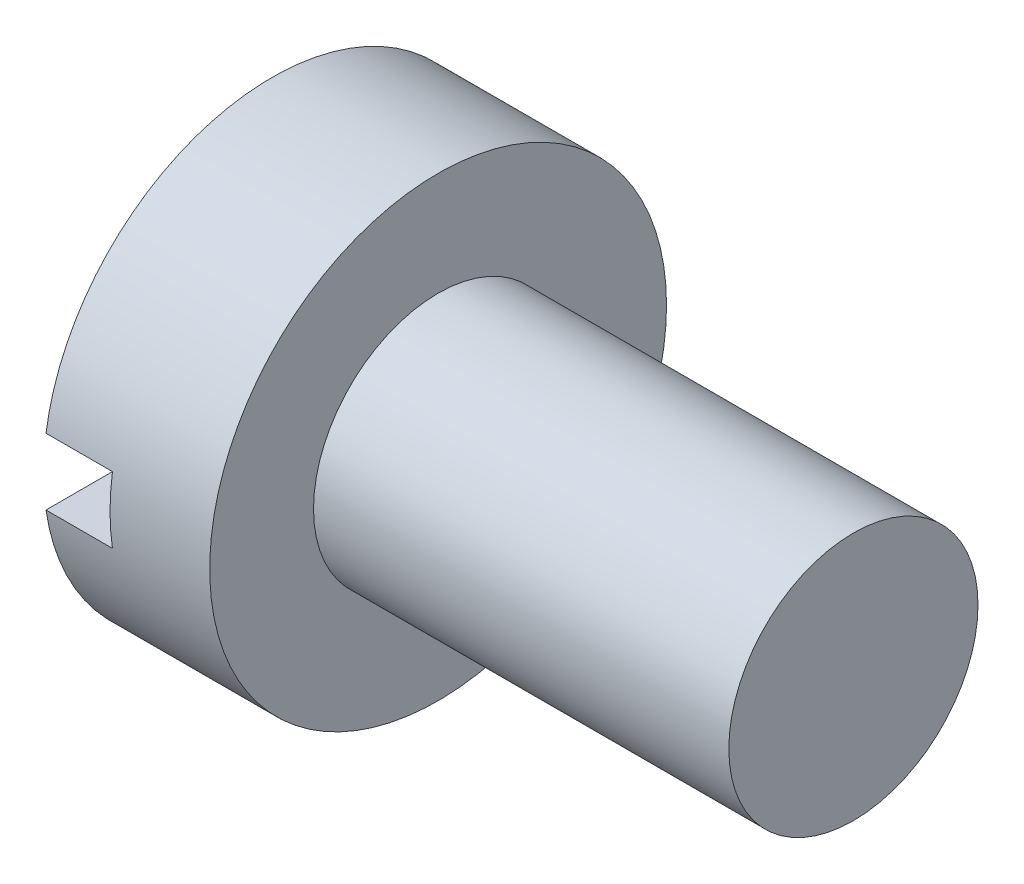
ISO-10303-21;
HEADER;
FILE_DESCRIPTION(('STEP AP214'),'2;1');
FILE_NAME('part.step','',(''),(''),'','','');
FILE_SCHEMA(('AUTOMOTIVE_DESIGN { 1 0 10303 214 1 1 1 1 }'));
ENDSEC;
DATA;
#1=APPLICATION_CONTEXT('core data for automotive mechanical design processes');
#2=APPLICATION_PROTOCOL_DEFINITION('international standard','automotive_design',2000,#1);
#3=PRODUCT_CONTEXT('',#1,'mechanical');
#4=PRODUCT('Part','Part','',(#3));
#5=PRODUCT_RELATED_PRODUCT_CATEGORY('part','',(#4));
#6=PRODUCT_DEFINITION_FORMATION('','',#4);
#7=PRODUCT_DEFINITION_CONTEXT('part definition',#1,'design');
#8=PRODUCT_DEFINITION('design','',#6,#7);
#9=PRODUCT_DEFINITION_SHAPE('','',#8);
#10=(LENGTH_UNIT() NAMED_UNIT(*) SI_UNIT(.MILLI.,.METRE.));
#11=(NAMED_UNIT(*) PLANE_ANGLE_UNIT() SI_UNIT($,.RADIAN.));
#12=(NAMED_UNIT(*) SI_UNIT($,.STERADIAN.) SOLID_ANGLE_UNIT());
#13=UNCERTAINTY_MEASURE_WITH_UNIT(LENGTH_MEASURE(1.E-05),#10,'distance_accuracy_value','');
#14=(GEOMETRIC_REPRESENTATION_CONTEXT(3) GLOBAL_UNCERTAINTY_ASSIGNED_CONTEXT((#13)) GLOBAL_UNIT_ASSIGNED_CONTEXT((#10,
#11,#12)) REPRESENTATION_CONTEXT('',''));
#15=CARTESIAN_POINT('',(0.,0.,0.));
#16=DIRECTION('',(0.,0.,1.));
#17=DIRECTION('',(1.,0.,0.));
#18=AXIS2_PLACEMENT_3D('',#15,#16,#17);
#19=CARTESIAN_POINT('',(0.,0.,0.));
#20=DIRECTION('',(-1.,0.,0.));
#21=DIRECTION('',(0.,0.,1.));
#22=AXIS2_PLACEMENT_3D('',#19,#20,#21);
#23=PLANE('',#22);
#24=DIRECTION('',(0.,0.,-1.));
#25=VECTOR('',#24,1.);
#26=CARTESIAN_POINT('',(0.,0.399999999999997,-2.75));
#27=LINE('',#26,#25);
#28=CARTESIAN_POINT('',(0.,0.399999999999999,2.72075357208256));
#29=VERTEX_POINT('',#28);
#30=CARTESIAN_POINT('',(0.,0.399999999999997,-2.72075357208256));
#31=VERTEX_POINT('',#30);
#32=EDGE_CURVE('E82',#29,#31,#27,.T.);
#33=ORIENTED_EDGE('',*,*,#32,.F.);
#34=CARTESIAN_POINT('',(0.,0.,0.));
#35=DIRECTION('',(1.,0.,0.));
#36=DIRECTION('',(0.,0.,-1.));
#37=AXIS2_PLACEMENT_3D('',#34,#35,#36);
#38=CIRCLE('',#37,2.75);
#39=EDGE_CURVE('E88',#31,#29,#38,.T.);
#40=ORIENTED_EDGE('',*,*,#39,.F.);
#41=EDGE_LOOP('',(#33,#40));
#42=FACE_BOUND('',#41,.T.);
#43=ADVANCED_FACE('F32',(#42),#23,.T.);
#44=DIRECTION('',(0.,0.,1.));
#45=VECTOR('',#44,1.);
#46=CARTESIAN_POINT('',(0.,-0.400000000000001,-2.75));
#47=LINE('',#46,#45);
#48=CARTESIAN_POINT('',(0.,-0.400000000000001,-2.72075357208256));
#49=VERTEX_POINT('',#48);
#50=CARTESIAN_POINT('',(0.,-0.399999999999999,2.72075357208256));
#51=VERTEX_POINT('',#50);
#52=EDGE_CURVE('E76',#49,#51,#47,.T.);
#53=ORIENTED_EDGE('',*,*,#52,.F.);
#54=EDGE_CURVE('E81',#51,#49,#38,.T.);
#55=ORIENTED_EDGE('',*,*,#54,.F.);
#56=EDGE_LOOP('',(#53,#55));
#57=FACE_BOUND('',#56,.T.);
#58=ADVANCED_FACE('F34',(#57),#23,.T.);
#59=CARTESIAN_POINT('',(7.,0.,0.));
#60=DIRECTION('',(1.,0.,0.));
#61=DIRECTION('',(0.,0.,-1.));
#62=AXIS2_PLACEMENT_3D('',#59,#60,#61);
#63=CYLINDRICAL_SURFACE('',#62,2.75);
#64=DIRECTION('',(1.,0.,0.));
#65=VECTOR('',#64,1.);
#66=CARTESIAN_POINT('',(7.,0.399999999999997,-2.72075357208256));
#67=LINE('',#66,#65);
#68=CARTESIAN_POINT('',(0.8,0.399999999999997,-2.72075357208256));
#69=VERTEX_POINT('',#68);
#70=EDGE_CURVE('E11',#31,#69,#67,.T.);
#71=ORIENTED_EDGE('',*,*,#70,.F.);
#72=ORIENTED_EDGE('',*,*,#39,.T.);
#73=DIRECTION('',(1.,0.,0.));
#74=VECTOR('',#73,1.);
#75=CARTESIAN_POINT('',(7.,0.399999999999999,2.72075357208256));
#76=LINE('',#75,#74);
#77=CARTESIAN_POINT('',(0.8,0.399999999999999,2.72075357208256));
#78=VERTEX_POINT('',#77);
#79=EDGE_CURVE('E99',#78,#29,#76,.F.);
#80=ORIENTED_EDGE('',*,*,#79,.F.);
#81=CARTESIAN_POINT('',(0.8,0.,0.));
#82=DIRECTION('',(-1.,0.,0.));
#83=DIRECTION('',(0.,0.,1.));
#84=AXIS2_PLACEMENT_3D('',#81,#82,#83);
#85=CIRCLE('',#84,2.75);
#86=CARTESIAN_POINT('',(0.8,-0.399999999999999,2.72075357208256));
#87=VERTEX_POINT('',#86);
#88=EDGE_CURVE('E47',#78,#87,#85,.F.);
#89=ORIENTED_EDGE('',*,*,#88,.T.);
#90=DIRECTION('',(1.,0.,0.));
#91=VECTOR('',#90,1.);
#92=CARTESIAN_POINT('',(7.,-0.399999999999999,2.72075357208256));
#93=LINE('',#92,#91);
#94=EDGE_CURVE('E87',#51,#87,#93,.T.);
#95=ORIENTED_EDGE('',*,*,#94,.F.);
#96=ORIENTED_EDGE('',*,*,#54,.T.);
#97=DIRECTION('',(1.,0.,0.));
#98=VECTOR('',#97,1.);
#99=CARTESIAN_POINT('',(7.,-0.400000000000001,-2.72075357208256));
#100=LINE('',#99,#98);
#101=CARTESIAN_POINT('',(0.8,-0.400000000000001,-2.72075357208256));
#102=VERTEX_POINT('',#101);
#103=EDGE_CURVE('E40',#102,#49,#100,.F.);
#104=ORIENTED_EDGE('',*,*,#103,.F.);
#105=EDGE_CURVE('E55',#102,#69,#85,.F.);
#106=ORIENTED_EDGE('',*,*,#105,.T.);
#107=EDGE_LOOP('',(#71,#72,#80,#89,#95,#96,#104,#106));
#108=FACE_BOUND('',#107,.T.);
#109=CARTESIAN_POINT('',(2.,0.,0.));
#110=DIRECTION('',(1.,0.,0.));
#111=DIRECTION('',(0.,0.,-1.));
#112=AXIS2_PLACEMENT_3D('',#109,#110,#111);
#113=CIRCLE('',#112,2.75);
#114=CARTESIAN_POINT('',(2.,0.,-2.75));
#115=VERTEX_POINT('',#114);
#116=EDGE_CURVE('E89',#115,#115,#113,.T.);
#117=ORIENTED_EDGE('',*,*,#116,.F.);
#118=EDGE_LOOP('',(#117));
#119=FACE_BOUND('',#118,.T.);
#120=ADVANCED_FACE('F85',(#108,#119),#63,.T.);
#121=CARTESIAN_POINT('',(2.,2.75,0.));
#122=DIRECTION('',(1.,0.,0.));
#123=DIRECTION('',(0.,0.,-1.));
#124=AXIS2_PLACEMENT_3D('',#121,#122,#123);
#125=PLANE('',#124);
#126=ORIENTED_EDGE('',*,*,#116,.T.);
#127=EDGE_LOOP('',(#126));
#128=FACE_BOUND('',#127,.T.);
#129=CARTESIAN_POINT('',(2.,0.,0.));
#130=DIRECTION('',(1.,0.,0.));
#131=DIRECTION('',(0.,0.,-1.));
#132=AXIS2_PLACEMENT_3D('',#129,#130,#131);
#133=CIRCLE('',#132,1.5);
#134=CARTESIAN_POINT('',(2.,0.,-1.5));
#135=VERTEX_POINT('',#134);
#136=EDGE_CURVE('E93',#135,#135,#133,.T.);
#137=ORIENTED_EDGE('',*,*,#136,.F.);
#138=EDGE_LOOP('',(#137));
#139=FACE_BOUND('',#138,.T.);
#140=ADVANCED_FACE('F118',(#128,#139),#125,.T.);
#141=CARTESIAN_POINT('',(7.,0.,0.));
#142=DIRECTION('',(1.,0.,0.));
#143=DIRECTION('',(0.,0.,-1.));
#144=AXIS2_PLACEMENT_3D('',#141,#142,#143);
#145=CYLINDRICAL_SURFACE('',#144,1.5);
#146=ORIENTED_EDGE('',*,*,#136,.T.);
#147=EDGE_LOOP('',(#146));
#148=FACE_BOUND('',#147,.T.);
#149=CARTESIAN_POINT('',(7.,0.,0.));
#150=DIRECTION('',(1.,0.,0.));
#151=DIRECTION('',(0.,0.,-1.));
#152=AXIS2_PLACEMENT_3D('',#149,#150,#151);
#153=CIRCLE('',#152,1.5);
#154=CARTESIAN_POINT('',(7.,0.,-1.5));
#155=VERTEX_POINT('',#154);
#156=EDGE_CURVE('E110',#155,#155,#153,.T.);
#157=ORIENTED_EDGE('',*,*,#156,.F.);
#158=EDGE_LOOP('',(#157));
#159=FACE_BOUND('',#158,.T.);
#160=ADVANCED_FACE('F115',(#148,#159),#145,.T.);
#161=CARTESIAN_POINT('',(7.,1.5,0.));
#162=DIRECTION('',(1.,0.,0.));
#163=DIRECTION('',(0.,0.,-1.));
#164=AXIS2_PLACEMENT_3D('',#161,#162,#163);
#165=PLANE('',#164);
#166=ORIENTED_EDGE('',*,*,#156,.T.);
#167=EDGE_LOOP('',(#166));
#168=FACE_BOUND('',#167,.T.);
#169=ADVANCED_FACE('F126',(#168),#165,.T.);
#170=CARTESIAN_POINT('',(0.8,0.399999999999997,-2.75));
#171=DIRECTION('',(0.,1.,0.));
#172=DIRECTION('',(0.,0.,1.));
#173=AXIS2_PLACEMENT_3D('',#170,#171,#172);
#174=PLANE('',#173);
#175=ORIENTED_EDGE('',*,*,#79,.T.);
#176=ORIENTED_EDGE('',*,*,#32,.T.);
#177=ORIENTED_EDGE('',*,*,#70,.T.);
#178=DIRECTION('',(0.,0.,-1.));
#179=VECTOR('',#178,1.);
#180=CARTESIAN_POINT('',(0.8,0.399999999999997,-2.75));
#181=LINE('',#180,#179);
#182=EDGE_CURVE('E106',#78,#69,#181,.T.);
#183=ORIENTED_EDGE('',*,*,#182,.F.);
#184=EDGE_LOOP('',(#175,#176,#177,#183));
#185=FACE_BOUND('',#184,.T.);
#186=ADVANCED_FACE('F144',(#185),#174,.F.);
#187=CARTESIAN_POINT('',(0.8,-0.400000000000001,-2.75));
#188=DIRECTION('',(0.,-1.,0.));
#189=DIRECTION('',(0.,0.,-1.));
#190=AXIS2_PLACEMENT_3D('',#187,#188,#189);
#191=PLANE('',#190);
#192=ORIENTED_EDGE('',*,*,#103,.T.);
#193=ORIENTED_EDGE('',*,*,#52,.T.);
#194=ORIENTED_EDGE('',*,*,#94,.T.);
#195=DIRECTION('',(0.,0.,1.));
#196=VECTOR('',#195,1.);
#197=CARTESIAN_POINT('',(0.8,-0.400000000000001,-2.75));
#198=LINE('',#197,#196);
#199=EDGE_CURVE('E77',#102,#87,#198,.T.);
#200=ORIENTED_EDGE('',*,*,#199,.F.);
#201=EDGE_LOOP('',(#192,#193,#194,#200));
#202=FACE_BOUND('',#201,.T.);
#203=ADVANCED_FACE('F75',(#202),#191,.F.);
#204=CARTESIAN_POINT('',(0.8,0.,0.));
#205=DIRECTION('',(-1.,0.,0.));
#206=DIRECTION('',(0.,0.,1.));
#207=AXIS2_PLACEMENT_3D('',#204,#205,#206);
#208=PLANE('',#207);
#209=ORIENTED_EDGE('',*,*,#199,.T.);
#210=ORIENTED_EDGE('',*,*,#88,.F.);
#211=ORIENTED_EDGE('',*,*,#182,.T.);
#212=ORIENTED_EDGE('',*,*,#105,.F.);
#213=EDGE_LOOP('',(#209,#210,#211,#212));
#214=FACE_BOUND('',#213,.T.);
#215=ADVANCED_FACE('F159',(#214),#208,.T.);
#216=CLOSED_SHELL('',(#43,#58,#120,#140,#160,#169,#186,#203,#215));
#217=MANIFOLD_SOLID_BREP('B2',#216);
#218=ADVANCED_BREP_SHAPE_REPRESENTATION('',(#18,#217),#14);
#219=SHAPE_DEFINITION_REPRESENTATION(#9,#218);
ENDSEC;
END-ISO-10303-21;
